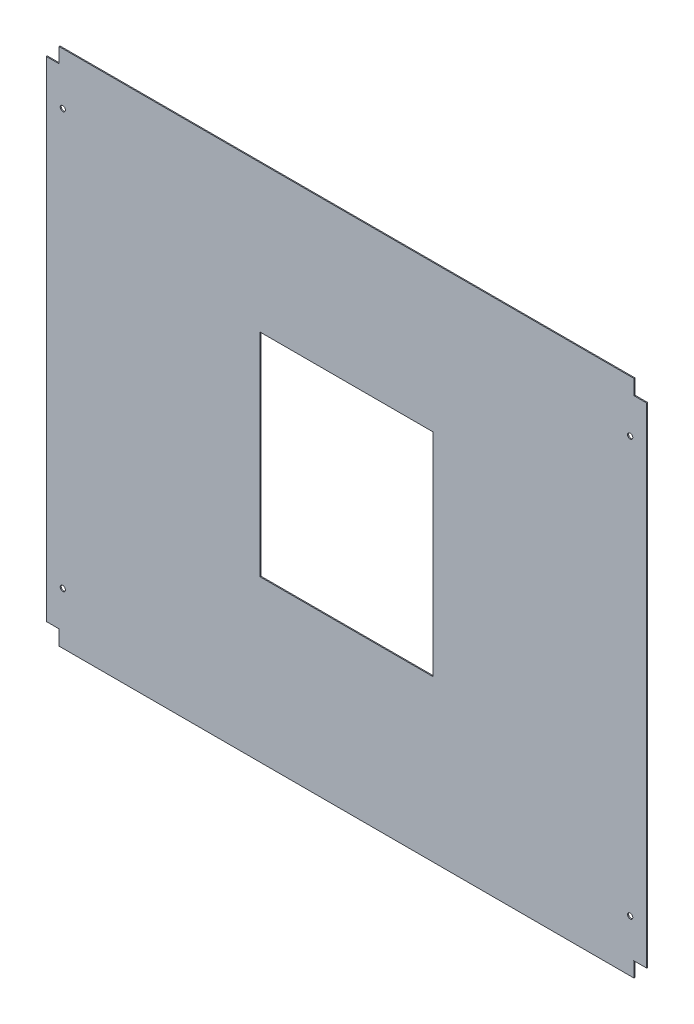
ISO-10303-21;
HEADER;
FILE_DESCRIPTION(('STEP AP214'),'2;1');
FILE_NAME('part.step','',(''),(''),'','','');
FILE_SCHEMA(('AUTOMOTIVE_DESIGN { 1 0 10303 214 1 1 1 1 }'));
ENDSEC;
DATA;
#1=APPLICATION_CONTEXT('core data for automotive mechanical design processes');
#2=APPLICATION_PROTOCOL_DEFINITION('international standard','automotive_design',2000,#1);
#3=PRODUCT_CONTEXT('',#1,'mechanical');
#4=PRODUCT('Part','Part','',(#3));
#5=PRODUCT_RELATED_PRODUCT_CATEGORY('part','',(#4));
#6=PRODUCT_DEFINITION_FORMATION('','',#4);
#7=PRODUCT_DEFINITION_CONTEXT('part definition',#1,'design');
#8=PRODUCT_DEFINITION('design','',#6,#7);
#9=PRODUCT_DEFINITION_SHAPE('','',#8);
#10=(LENGTH_UNIT() NAMED_UNIT(*) SI_UNIT(.MILLI.,.METRE.));
#11=(NAMED_UNIT(*) PLANE_ANGLE_UNIT() SI_UNIT($,.RADIAN.));
#12=(NAMED_UNIT(*) SI_UNIT($,.STERADIAN.) SOLID_ANGLE_UNIT());
#13=UNCERTAINTY_MEASURE_WITH_UNIT(LENGTH_MEASURE(1.E-05),#10,'distance_accuracy_value','');
#14=(GEOMETRIC_REPRESENTATION_CONTEXT(3) GLOBAL_UNCERTAINTY_ASSIGNED_CONTEXT((#13)) GLOBAL_UNIT_ASSIGNED_CONTEXT((#10,
#11,#12)) REPRESENTATION_CONTEXT('',''));
#15=CARTESIAN_POINT('',(0.,0.,0.));
#16=DIRECTION('',(0.,0.,1.));
#17=DIRECTION('',(1.,0.,0.));
#18=AXIS2_PLACEMENT_3D('',#15,#16,#17);
#19=CARTESIAN_POINT('',(-438.8866,374.0404,-1.52400000000006));
#20=DIRECTION('',(-1.,0.,0.));
#21=DIRECTION('',(0.,0.,1.));
#22=AXIS2_PLACEMENT_3D('',#19,#20,#21);
#23=PLANE('',#22);
#24=DIRECTION('',(0.,0.,1.));
#25=VECTOR('',#24,1.);
#26=CARTESIAN_POINT('',(-438.8866,373.888,-1.52400000000006));
#27=LINE('',#26,#25);
#28=CARTESIAN_POINT('',(-438.8866,373.888,-1.524));
#29=VERTEX_POINT('',#28);
#30=CARTESIAN_POINT('',(-438.8866,373.888,0.));
#31=VERTEX_POINT('',#30);
#32=EDGE_CURVE('E330',#29,#31,#27,.T.);
#33=ORIENTED_EDGE('',*,*,#32,.T.);
#34=DIRECTION('',(0.,1.,0.));
#35=VECTOR('',#34,1.);
#36=CARTESIAN_POINT('',(-438.8866,0.,0.));
#37=LINE('',#36,#35);
#38=CARTESIAN_POINT('',(-438.8866,374.0404,0.));
#39=VERTEX_POINT('',#38);
#40=EDGE_CURVE('E11',#31,#39,#37,.T.);
#41=ORIENTED_EDGE('',*,*,#40,.T.);
#42=DIRECTION('',(0.,0.,1.));
#43=VECTOR('',#42,1.);
#44=CARTESIAN_POINT('',(-438.8866,374.0404,-1.52400000000006));
#45=LINE('',#44,#43);
#46=CARTESIAN_POINT('',(-438.8866,374.0404,-1.524));
#47=VERTEX_POINT('',#46);
#48=EDGE_CURVE('E327',#47,#39,#45,.T.);
#49=ORIENTED_EDGE('',*,*,#48,.F.);
#50=DIRECTION('',(0.,-1.,0.));
#51=VECTOR('',#50,1.);
#52=CARTESIAN_POINT('',(-438.8866,374.0404,-1.52400000000006));
#53=LINE('',#52,#51);
#54=EDGE_CURVE('E61',#47,#29,#53,.T.);
#55=ORIENTED_EDGE('',*,*,#54,.T.);
#56=EDGE_LOOP('',(#33,#41,#49,#55));
#57=FACE_BOUND('',#56,.T.);
#58=ADVANCED_FACE('F45',(#57),#23,.T.);
#59=CARTESIAN_POINT('',(-438.8866,-373.888,-1.52400000000006));
#60=DIRECTION('',(-1.,0.,0.));
#61=DIRECTION('',(0.,0.,1.));
#62=AXIS2_PLACEMENT_3D('',#59,#60,#61);
#63=PLANE('',#62);
#64=DIRECTION('',(0.,0.,1.));
#65=VECTOR('',#64,1.);
#66=CARTESIAN_POINT('',(-438.8866,-374.0404,-1.52400000000006));
#67=LINE('',#66,#65);
#68=CARTESIAN_POINT('',(-438.8866,-374.0404,-1.524));
#69=VERTEX_POINT('',#68);
#70=CARTESIAN_POINT('',(-438.8866,-374.0404,0.));
#71=VERTEX_POINT('',#70);
#72=EDGE_CURVE('E320',#69,#71,#67,.T.);
#73=ORIENTED_EDGE('',*,*,#72,.T.);
#74=DIRECTION('',(0.,1.,0.));
#75=VECTOR('',#74,1.);
#76=CARTESIAN_POINT('',(-438.8866,0.,0.));
#77=LINE('',#76,#75);
#78=CARTESIAN_POINT('',(-438.8866,-373.888,0.));
#79=VERTEX_POINT('',#78);
#80=EDGE_CURVE('E54',#71,#79,#77,.T.);
#81=ORIENTED_EDGE('',*,*,#80,.T.);
#82=DIRECTION('',(0.,0.,1.));
#83=VECTOR('',#82,1.);
#84=CARTESIAN_POINT('',(-438.8866,-373.888,-1.52400000000006));
#85=LINE('',#84,#83);
#86=CARTESIAN_POINT('',(-438.8866,-373.888,-1.524));
#87=VERTEX_POINT('',#86);
#88=EDGE_CURVE('E339',#87,#79,#85,.T.);
#89=ORIENTED_EDGE('',*,*,#88,.F.);
#90=DIRECTION('',(0.,-1.,0.));
#91=VECTOR('',#90,1.);
#92=CARTESIAN_POINT('',(-438.8866,-373.888,-1.52400000000006));
#93=LINE('',#92,#91);
#94=EDGE_CURVE('E335',#87,#69,#93,.T.);
#95=ORIENTED_EDGE('',*,*,#94,.T.);
#96=EDGE_LOOP('',(#73,#81,#89,#95));
#97=FACE_BOUND('',#96,.T.);
#98=ADVANCED_FACE('F514',(#97),#63,.T.);
#99=CARTESIAN_POINT('',(-438.8866,-374.0404,-1.52400000000006));
#100=DIRECTION('',(0.,1.,0.));
#101=DIRECTION('',(0.,0.,1.));
#102=AXIS2_PLACEMENT_3D('',#99,#100,#101);
#103=PLANE('',#102);
#104=DIRECTION('',(0.,0.,1.));
#105=VECTOR('',#104,1.);
#106=CARTESIAN_POINT('',(-439.039,-374.0404,-1.524));
#107=LINE('',#106,#105);
#108=CARTESIAN_POINT('',(-439.039,-374.0404,-1.524));
#109=VERTEX_POINT('',#108);
#110=CARTESIAN_POINT('',(-439.039,-374.0404,0.));
#111=VERTEX_POINT('',#110);
#112=EDGE_CURVE('E506',#109,#111,#107,.T.);
#113=ORIENTED_EDGE('',*,*,#112,.T.);
#114=DIRECTION('',(1.,0.,0.));
#115=VECTOR('',#114,1.);
#116=CARTESIAN_POINT('',(0.,-374.0404,0.));
#117=LINE('',#116,#115);
#118=EDGE_CURVE('E366',#111,#71,#117,.T.);
#119=ORIENTED_EDGE('',*,*,#118,.T.);
#120=ORIENTED_EDGE('',*,*,#72,.F.);
#121=DIRECTION('',(-1.,0.,0.));
#122=VECTOR('',#121,1.);
#123=CARTESIAN_POINT('',(-438.8866,-374.0404,-1.52400000000006));
#124=LINE('',#123,#122);
#125=EDGE_CURVE('E340',#69,#109,#124,.T.);
#126=ORIENTED_EDGE('',*,*,#125,.T.);
#127=EDGE_LOOP('',(#113,#119,#120,#126));
#128=FACE_BOUND('',#127,.T.);
#129=ADVANCED_FACE('F522',(#128),#103,.T.);
#130=CARTESIAN_POINT('',(-442.087,374.0404,-1.52400000000006));
#131=DIRECTION('',(0.,-1.,0.));
#132=DIRECTION('',(0.,0.,-1.));
#133=AXIS2_PLACEMENT_3D('',#130,#131,#132);
#134=PLANE('',#133);
#135=ORIENTED_EDGE('',*,*,#48,.T.);
#136=DIRECTION('',(-1.,0.,0.));
#137=VECTOR('',#136,1.);
#138=CARTESIAN_POINT('',(0.,374.0404,0.));
#139=LINE('',#138,#137);
#140=CARTESIAN_POINT('',(-439.039,374.0404,0.));
#141=VERTEX_POINT('',#140);
#142=EDGE_CURVE('E362',#39,#141,#139,.T.);
#143=ORIENTED_EDGE('',*,*,#142,.T.);
#144=DIRECTION('',(0.,0.,-1.));
#145=VECTOR('',#144,1.);
#146=CARTESIAN_POINT('',(-439.039,374.0404,-1.524));
#147=LINE('',#146,#145);
#148=CARTESIAN_POINT('',(-439.039,374.0404,-1.52400000000006));
#149=VERTEX_POINT('',#148);
#150=EDGE_CURVE('E502',#141,#149,#147,.T.);
#151=ORIENTED_EDGE('',*,*,#150,.T.);
#152=DIRECTION('',(1.,0.,0.));
#153=VECTOR('',#152,1.);
#154=CARTESIAN_POINT('',(-442.087,374.0404,-1.52400000000006));
#155=LINE('',#154,#153);
#156=EDGE_CURVE('E321',#149,#47,#155,.T.);
#157=ORIENTED_EDGE('',*,*,#156,.T.);
#158=EDGE_LOOP('',(#135,#143,#151,#157));
#159=FACE_BOUND('',#158,.T.);
#160=ADVANCED_FACE('F575',(#159),#134,.T.);
#161=CARTESIAN_POINT('',(-438.8866,373.888,-1.52400000000006));
#162=DIRECTION('',(0.,1.,0.));
#163=DIRECTION('',(0.,0.,1.));
#164=AXIS2_PLACEMENT_3D('',#161,#162,#163);
#165=PLANE('',#164);
#166=DIRECTION('',(-1.,0.,0.));
#167=VECTOR('',#166,1.);
#168=CARTESIAN_POINT('',(-438.8866,373.888,-1.52400000000006));
#169=LINE('',#168,#167);
#170=CARTESIAN_POINT('',(-458.583962531012,373.888,-1.5239999999998));
#171=VERTEX_POINT('',#170);
#172=EDGE_CURVE('E66',#29,#171,#169,.T.);
#173=ORIENTED_EDGE('',*,*,#172,.T.);
#174=DIRECTION('',(0.,0.,-1.));
#175=VECTOR('',#174,1.);
#176=CARTESIAN_POINT('',(-458.583962531012,373.888,2.22044604925031E-13));
#177=LINE('',#176,#175);
#178=CARTESIAN_POINT('',(-458.583962531012,373.888,2.22044604925031E-13));
#179=VERTEX_POINT('',#178);
#180=EDGE_CURVE('E282',#179,#171,#177,.T.);
#181=ORIENTED_EDGE('',*,*,#180,.F.);
#182=DIRECTION('',(1.,0.,0.));
#183=VECTOR('',#182,1.);
#184=CARTESIAN_POINT('',(0.,373.888,0.));
#185=LINE('',#184,#183);
#186=EDGE_CURVE('E358',#179,#31,#185,.T.);
#187=ORIENTED_EDGE('',*,*,#186,.T.);
#188=ORIENTED_EDGE('',*,*,#32,.F.);
#189=EDGE_LOOP('',(#173,#181,#187,#188));
#190=FACE_BOUND('',#189,.T.);
#191=ADVANCED_FACE('F573',(#190),#165,.T.);
#192=CARTESIAN_POINT('',(-439.039,-373.888,-1.52400000000006));
#193=DIRECTION('',(0.,-1.,0.));
#194=DIRECTION('',(0.,0.,-1.));
#195=AXIS2_PLACEMENT_3D('',#192,#193,#194);
#196=PLANE('',#195);
#197=ORIENTED_EDGE('',*,*,#88,.T.);
#198=DIRECTION('',(-1.,0.,0.));
#199=VECTOR('',#198,1.);
#200=CARTESIAN_POINT('',(0.,-373.888,0.));
#201=LINE('',#200,#199);
#202=CARTESIAN_POINT('',(-458.583962531012,-373.888,1.11022302462516E-13));
#203=VERTEX_POINT('',#202);
#204=EDGE_CURVE('E324',#79,#203,#201,.T.);
#205=ORIENTED_EDGE('',*,*,#204,.T.);
#206=DIRECTION('',(0.,0.,-1.));
#207=VECTOR('',#206,1.);
#208=CARTESIAN_POINT('',(-458.583962531012,-373.888,1.11022302462516E-13));
#209=LINE('',#208,#207);
#210=CARTESIAN_POINT('',(-458.583962531012,-373.888,-1.52399999999991));
#211=VERTEX_POINT('',#210);
#212=EDGE_CURVE('E274',#203,#211,#209,.T.);
#213=ORIENTED_EDGE('',*,*,#212,.T.);
#214=DIRECTION('',(1.,0.,0.));
#215=VECTOR('',#214,1.);
#216=CARTESIAN_POINT('',(-439.039,-373.888,-1.52400000000006));
#217=LINE('',#216,#215);
#218=EDGE_CURVE('E331',#211,#87,#217,.T.);
#219=ORIENTED_EDGE('',*,*,#218,.T.);
#220=EDGE_LOOP('',(#197,#205,#213,#219));
#221=FACE_BOUND('',#220,.T.);
#222=ADVANCED_FACE('F517',(#221),#196,.T.);
#223=CARTESIAN_POINT('',(0.,0.,-1.524));
#224=DIRECTION('',(0.,0.,-1.));
#225=DIRECTION('',(-1.,0.,0.));
#226=AXIS2_PLACEMENT_3D('',#223,#224,#225);
#227=PLANE('',#226);
#228=CARTESIAN_POINT('',(-433.451,-317.5,-1.524));
#229=DIRECTION('',(0.,0.,-1.));
#230=DIRECTION('',(-1.,0.,0.));
#231=AXIS2_PLACEMENT_3D('',#228,#229,#230);
#232=CIRCLE('',#231,3.9624);
#233=CARTESIAN_POINT('',(-437.4134,-317.5,-1.524));
#234=VERTEX_POINT('',#233);
#235=EDGE_CURVE('E316',#234,#234,#232,.T.);
#236=ORIENTED_EDGE('',*,*,#235,.F.);
#237=EDGE_LOOP('',(#236));
#238=FACE_BOUND('',#237,.T.);
#239=CARTESIAN_POINT('',(433.451,317.5,-1.524));
#240=DIRECTION('',(0.,0.,-1.));
#241=DIRECTION('',(-1.,0.,0.));
#242=AXIS2_PLACEMENT_3D('',#239,#240,#241);
#243=CIRCLE('',#242,3.9624);
#244=CARTESIAN_POINT('',(429.4886,317.5,-1.524));
#245=VERTEX_POINT('',#244);
#246=EDGE_CURVE('E312',#245,#245,#243,.T.);
#247=ORIENTED_EDGE('',*,*,#246,.F.);
#248=EDGE_LOOP('',(#247));
#249=FACE_BOUND('',#248,.T.);
#250=CARTESIAN_POINT('',(433.451,-317.5,-1.524));
#251=DIRECTION('',(0.,0.,-1.));
#252=DIRECTION('',(-1.,0.,0.));
#253=AXIS2_PLACEMENT_3D('',#250,#251,#252);
#254=CIRCLE('',#253,3.9624);
#255=CARTESIAN_POINT('',(429.4886,-317.5,-1.524));
#256=VERTEX_POINT('',#255);
#257=EDGE_CURVE('E308',#256,#256,#254,.T.);
#258=ORIENTED_EDGE('',*,*,#257,.F.);
#259=EDGE_LOOP('',(#258));
#260=FACE_BOUND('',#259,.T.);
#261=CARTESIAN_POINT('',(-433.451,317.5,-1.524));
#262=DIRECTION('',(0.,0.,-1.));
#263=DIRECTION('',(-1.,0.,0.));
#264=AXIS2_PLACEMENT_3D('',#261,#262,#263);
#265=CIRCLE('',#264,3.9624);
#266=CARTESIAN_POINT('',(-437.4134,317.5,-1.524));
#267=VERTEX_POINT('',#266);
#268=EDGE_CURVE('E304',#267,#267,#265,.T.);
#269=ORIENTED_EDGE('',*,*,#268,.F.);
#270=EDGE_LOOP('',(#269));
#271=FACE_BOUND('',#270,.T.);
#272=DIRECTION('',(0.,-1.,0.));
#273=VECTOR('',#272,1.);
#274=CARTESIAN_POINT('',(-132.207,172.466,-1.524));
#275=LINE('',#274,#273);
#276=CARTESIAN_POINT('',(-132.207,172.466,-1.524));
#277=VERTEX_POINT('',#276);
#278=CARTESIAN_POINT('',(-132.207,-151.384,-1.524));
#279=VERTEX_POINT('',#278);
#280=EDGE_CURVE('E444',#277,#279,#275,.T.);
#281=ORIENTED_EDGE('',*,*,#280,.T.);
#282=DIRECTION('',(1.,0.,0.));
#283=VECTOR('',#282,1.);
#284=CARTESIAN_POINT('',(-132.207,-151.384,-1.524));
#285=LINE('',#284,#283);
#286=CARTESIAN_POINT('',(132.207,-151.384,-1.524));
#287=VERTEX_POINT('',#286);
#288=EDGE_CURVE('E448',#279,#287,#285,.T.);
#289=ORIENTED_EDGE('',*,*,#288,.T.);
#290=DIRECTION('',(0.,1.,0.));
#291=VECTOR('',#290,1.);
#292=CARTESIAN_POINT('',(132.207,172.466,-1.524));
#293=LINE('',#292,#291);
#294=CARTESIAN_POINT('',(132.207,172.466,-1.524));
#295=VERTEX_POINT('',#294);
#296=EDGE_CURVE('E453',#287,#295,#293,.T.);
#297=ORIENTED_EDGE('',*,*,#296,.T.);
#298=DIRECTION('',(-1.,0.,0.));
#299=VECTOR('',#298,1.);
#300=CARTESIAN_POINT('',(-132.207,172.466,-1.524));
#301=LINE('',#300,#299);
#302=EDGE_CURVE('E457',#295,#277,#301,.T.);
#303=ORIENTED_EDGE('',*,*,#302,.T.);
#304=EDGE_LOOP('',(#281,#289,#297,#303));
#305=FACE_BOUND('',#304,.T.);
#306=ORIENTED_EDGE('',*,*,#54,.F.);
#307=ORIENTED_EDGE('',*,*,#156,.F.);
#308=DIRECTION('',(0.,1.,0.));
#309=VECTOR('',#308,1.);
#310=CARTESIAN_POINT('',(-439.039,380.238,-1.524));
#311=LINE('',#310,#309);
#312=CARTESIAN_POINT('',(-439.039,396.734962531012,-1.52399999999991));
#313=VERTEX_POINT('',#312);
#314=EDGE_CURVE('E438',#149,#313,#311,.T.);
#315=ORIENTED_EDGE('',*,*,#314,.T.);
#316=DIRECTION('',(-1.,0.,0.));
#317=VECTOR('',#316,1.);
#318=CARTESIAN_POINT('',(0.,396.734962531012,-1.52399999999997));
#319=LINE('',#318,#317);
#320=CARTESIAN_POINT('',(439.039,396.734962531012,-1.52400000000003));
#321=VERTEX_POINT('',#320);
#322=EDGE_CURVE('E228',#313,#321,#319,.F.);
#323=ORIENTED_EDGE('',*,*,#322,.T.);
#324=DIRECTION('',(0.,-1.,0.));
#325=VECTOR('',#324,1.);
#326=CARTESIAN_POINT('',(439.039,380.238,-1.524));
#327=LINE('',#326,#325);
#328=CARTESIAN_POINT('',(439.039,374.0404,-1.524));
#329=VERTEX_POINT('',#328);
#330=EDGE_CURVE('E218',#321,#329,#327,.T.);
#331=ORIENTED_EDGE('',*,*,#330,.T.);
#332=DIRECTION('',(1.,0.,0.));
#333=VECTOR('',#332,1.);
#334=CARTESIAN_POINT('',(438.8866,374.0404,-1.52400000000003));
#335=LINE('',#334,#333);
#336=CARTESIAN_POINT('',(438.8866,374.0404,-1.524));
#337=VERTEX_POINT('',#336);
#338=EDGE_CURVE('E394',#337,#329,#335,.T.);
#339=ORIENTED_EDGE('',*,*,#338,.F.);
#340=DIRECTION('',(0.,1.,0.));
#341=VECTOR('',#340,1.);
#342=CARTESIAN_POINT('',(438.8866,373.888,-1.52400000000003));
#343=LINE('',#342,#341);
#344=CARTESIAN_POINT('',(438.8866,373.888,-1.524));
#345=VERTEX_POINT('',#344);
#346=EDGE_CURVE('E389',#345,#337,#343,.T.);
#347=ORIENTED_EDGE('',*,*,#346,.F.);
#348=DIRECTION('',(-1.,0.,0.));
#349=VECTOR('',#348,1.);
#350=CARTESIAN_POINT('',(439.039,373.888,-1.52400000000003));
#351=LINE('',#350,#349);
#352=CARTESIAN_POINT('',(458.583962531012,373.888,-1.52399999999991));
#353=VERTEX_POINT('',#352);
#354=EDGE_CURVE('E385',#353,#345,#351,.T.);
#355=ORIENTED_EDGE('',*,*,#354,.F.);
#356=DIRECTION('',(0.,-1.,0.));
#357=VECTOR('',#356,1.);
#358=CARTESIAN_POINT('',(458.583962531012,0.,-1.52399999999986));
#359=LINE('',#358,#357);
#360=CARTESIAN_POINT('',(458.583962531012,-373.888,-1.5239999999998));
#361=VERTEX_POINT('',#360);
#362=EDGE_CURVE('E246',#353,#361,#359,.T.);
#363=ORIENTED_EDGE('',*,*,#362,.T.);
#364=DIRECTION('',(1.,0.,0.));
#365=VECTOR('',#364,1.);
#366=CARTESIAN_POINT('',(438.8866,-373.888,-1.52400000000003));
#367=LINE('',#366,#365);
#368=CARTESIAN_POINT('',(438.8866,-373.888,-1.524));
#369=VERTEX_POINT('',#368);
#370=EDGE_CURVE('E381',#369,#361,#367,.T.);
#371=ORIENTED_EDGE('',*,*,#370,.F.);
#372=DIRECTION('',(0.,1.,0.));
#373=VECTOR('',#372,1.);
#374=CARTESIAN_POINT('',(438.8866,-374.0404,-1.52400000000003));
#375=LINE('',#374,#373);
#376=CARTESIAN_POINT('',(438.8866,-374.0404,-1.524));
#377=VERTEX_POINT('',#376);
#378=EDGE_CURVE('E376',#377,#369,#375,.T.);
#379=ORIENTED_EDGE('',*,*,#378,.F.);
#380=DIRECTION('',(-1.,0.,0.));
#381=VECTOR('',#380,1.);
#382=CARTESIAN_POINT('',(442.087,-374.0404,-1.52400000000003));
#383=LINE('',#382,#381);
#384=CARTESIAN_POINT('',(439.039,-374.0404,-1.52400000000003));
#385=VERTEX_POINT('',#384);
#386=EDGE_CURVE('E371',#385,#377,#383,.T.);
#387=ORIENTED_EDGE('',*,*,#386,.F.);
#388=DIRECTION('',(0.,-1.,0.));
#389=VECTOR('',#388,1.);
#390=CARTESIAN_POINT('',(439.039,-380.238,-1.524));
#391=LINE('',#390,#389);
#392=CARTESIAN_POINT('',(439.039,-396.734962531012,-1.52399999999991));
#393=VERTEX_POINT('',#392);
#394=EDGE_CURVE('E422',#385,#393,#391,.T.);
#395=ORIENTED_EDGE('',*,*,#394,.T.);
#396=DIRECTION('',(-1.,0.,0.));
#397=VECTOR('',#396,1.);
#398=CARTESIAN_POINT('',(0.,-396.734962531012,-1.52399999999991));
#399=LINE('',#398,#397);
#400=CARTESIAN_POINT('',(-439.039,-396.734962531012,-1.52399999999991));
#401=VERTEX_POINT('',#400);
#402=EDGE_CURVE('E263',#393,#401,#399,.T.);
#403=ORIENTED_EDGE('',*,*,#402,.T.);
#404=DIRECTION('',(0.,1.,0.));
#405=VECTOR('',#404,1.);
#406=CARTESIAN_POINT('',(-439.039,-380.238,-1.524));
#407=LINE('',#406,#405);
#408=EDGE_CURVE('E426',#401,#109,#407,.T.);
#409=ORIENTED_EDGE('',*,*,#408,.T.);
#410=ORIENTED_EDGE('',*,*,#125,.F.);
#411=ORIENTED_EDGE('',*,*,#94,.F.);
#412=ORIENTED_EDGE('',*,*,#218,.F.);
#413=DIRECTION('',(0.,1.,0.));
#414=VECTOR('',#413,1.);
#415=CARTESIAN_POINT('',(-458.583962531012,0.,-1.52399999999986));
#416=LINE('',#415,#414);
#417=EDGE_CURVE('E279',#211,#171,#416,.T.);
#418=ORIENTED_EDGE('',*,*,#417,.T.);
#419=ORIENTED_EDGE('',*,*,#172,.F.);
#420=EDGE_LOOP('',(#306,#307,#315,#323,#331,#339,#347,#355,#363,#371,#379,#387,#395,#403,#409,
#410,#411,#412,#418,#419));
#421=FACE_BOUND('',#420,.T.);
#422=ADVANCED_FACE('F520',(#238,#249,#260,#271,#305,#421),#227,.T.);
#423=CARTESIAN_POINT('',(0.,0.,0.));
#424=DIRECTION('',(0.,0.,-1.));
#425=DIRECTION('',(-1.,0.,0.));
#426=AXIS2_PLACEMENT_3D('',#423,#424,#425);
#427=PLANE('',#426);
#428=CARTESIAN_POINT('',(-433.451,-317.5,0.));
#429=DIRECTION('',(0.,0.,1.));
#430=DIRECTION('',(1.,0.,0.));
#431=AXIS2_PLACEMENT_3D('',#428,#429,#430);
#432=CIRCLE('',#431,3.9624);
#433=CARTESIAN_POINT('',(-429.4886,-317.5,0.));
#434=VERTEX_POINT('',#433);
#435=EDGE_CURVE('E293',#434,#434,#432,.T.);
#436=ORIENTED_EDGE('',*,*,#435,.F.);
#437=EDGE_LOOP('',(#436));
#438=FACE_BOUND('',#437,.T.);
#439=CARTESIAN_POINT('',(433.451,317.5,0.));
#440=DIRECTION('',(0.,0.,1.));
#441=DIRECTION('',(1.,0.,0.));
#442=AXIS2_PLACEMENT_3D('',#439,#440,#441);
#443=CIRCLE('',#442,3.9624);
#444=CARTESIAN_POINT('',(437.4134,317.5,0.));
#445=VERTEX_POINT('',#444);
#446=EDGE_CURVE('E292',#445,#445,#443,.T.);
#447=ORIENTED_EDGE('',*,*,#446,.F.);
#448=EDGE_LOOP('',(#447));
#449=FACE_BOUND('',#448,.T.);
#450=CARTESIAN_POINT('',(433.451,-317.5,0.));
#451=DIRECTION('',(0.,0.,1.));
#452=DIRECTION('',(1.,0.,0.));
#453=AXIS2_PLACEMENT_3D('',#450,#451,#452);
#454=CIRCLE('',#453,3.9624);
#455=CARTESIAN_POINT('',(437.4134,-317.5,0.));
#456=VERTEX_POINT('',#455);
#457=EDGE_CURVE('E278',#456,#456,#454,.T.);
#458=ORIENTED_EDGE('',*,*,#457,.F.);
#459=EDGE_LOOP('',(#458));
#460=FACE_BOUND('',#459,.T.);
#461=CARTESIAN_POINT('',(-433.451,317.5,0.));
#462=DIRECTION('',(0.,0.,1.));
#463=DIRECTION('',(1.,0.,0.));
#464=AXIS2_PLACEMENT_3D('',#461,#462,#463);
#465=CIRCLE('',#464,3.9624);
#466=CARTESIAN_POINT('',(-429.4886,317.5,0.));
#467=VERTEX_POINT('',#466);
#468=EDGE_CURVE('E297',#467,#467,#465,.T.);
#469=ORIENTED_EDGE('',*,*,#468,.F.);
#470=EDGE_LOOP('',(#469));
#471=FACE_BOUND('',#470,.T.);
#472=DIRECTION('',(1.,0.,0.));
#473=VECTOR('',#472,1.);
#474=CARTESIAN_POINT('',(-132.207,-151.384,0.));
#475=LINE('',#474,#473);
#476=CARTESIAN_POINT('',(-132.207,-151.384,0.));
#477=VERTEX_POINT('',#476);
#478=CARTESIAN_POINT('',(132.207,-151.384,0.));
#479=VERTEX_POINT('',#478);
#480=EDGE_CURVE('E464',#477,#479,#475,.T.);
#481=ORIENTED_EDGE('',*,*,#480,.F.);
#482=DIRECTION('',(0.,-1.,0.));
#483=VECTOR('',#482,1.);
#484=CARTESIAN_POINT('',(-132.207,172.466,0.));
#485=LINE('',#484,#483);
#486=CARTESIAN_POINT('',(-132.207,172.466,0.));
#487=VERTEX_POINT('',#486);
#488=EDGE_CURVE('E441',#487,#477,#485,.T.);
#489=ORIENTED_EDGE('',*,*,#488,.F.);
#490=DIRECTION('',(-1.,0.,0.));
#491=VECTOR('',#490,1.);
#492=CARTESIAN_POINT('',(-132.207,172.466,0.));
#493=LINE('',#492,#491);
#494=CARTESIAN_POINT('',(132.207,172.466,0.));
#495=VERTEX_POINT('',#494);
#496=EDGE_CURVE('E449',#495,#487,#493,.T.);
#497=ORIENTED_EDGE('',*,*,#496,.F.);
#498=DIRECTION('',(0.,1.,0.));
#499=VECTOR('',#498,1.);
#500=CARTESIAN_POINT('',(132.207,172.466,0.));
#501=LINE('',#500,#499);
#502=EDGE_CURVE('E468',#479,#495,#501,.T.);
#503=ORIENTED_EDGE('',*,*,#502,.F.);
#504=EDGE_LOOP('',(#481,#489,#497,#503));
#505=FACE_BOUND('',#504,.T.);
#506=ORIENTED_EDGE('',*,*,#142,.F.);
#507=ORIENTED_EDGE('',*,*,#40,.F.);
#508=ORIENTED_EDGE('',*,*,#186,.F.);
#509=DIRECTION('',(0.,-1.,0.));
#510=VECTOR('',#509,1.);
#511=CARTESIAN_POINT('',(-458.583962531012,-373.888,1.11022302462516E-13));
#512=LINE('',#511,#510);
#513=EDGE_CURVE('E262',#203,#179,#512,.F.);
#514=ORIENTED_EDGE('',*,*,#513,.F.);
#515=ORIENTED_EDGE('',*,*,#204,.F.);
#516=ORIENTED_EDGE('',*,*,#80,.F.);
#517=ORIENTED_EDGE('',*,*,#118,.F.);
#518=DIRECTION('',(0.,1.,0.));
#519=VECTOR('',#518,1.);
#520=CARTESIAN_POINT('',(-439.039,-380.238,0.));
#521=LINE('',#520,#519);
#522=CARTESIAN_POINT('',(-439.039,-396.734962531012,1.11022302462516E-13));
#523=VERTEX_POINT('',#522);
#524=EDGE_CURVE('E431',#523,#111,#521,.T.);
#525=ORIENTED_EDGE('',*,*,#524,.F.);
#526=DIRECTION('',(1.,0.,0.));
#527=VECTOR('',#526,1.);
#528=CARTESIAN_POINT('',(439.039,-396.734962531012,1.11022302462516E-13));
#529=LINE('',#528,#527);
#530=CARTESIAN_POINT('',(439.039,-396.734962531012,1.11022302462516E-13));
#531=VERTEX_POINT('',#530);
#532=EDGE_CURVE('E245',#531,#523,#529,.F.);
#533=ORIENTED_EDGE('',*,*,#532,.F.);
#534=DIRECTION('',(0.,-1.,0.));
#535=VECTOR('',#534,1.);
#536=CARTESIAN_POINT('',(439.039,-380.238,0.));
#537=LINE('',#536,#535);
#538=CARTESIAN_POINT('',(439.039,-374.0404,0.));
#539=VERTEX_POINT('',#538);
#540=EDGE_CURVE('E423',#539,#531,#537,.T.);
#541=ORIENTED_EDGE('',*,*,#540,.F.);
#542=DIRECTION('',(1.,0.,0.));
#543=VECTOR('',#542,1.);
#544=CARTESIAN_POINT('',(0.,-374.0404,0.));
#545=LINE('',#544,#543);
#546=CARTESIAN_POINT('',(438.8866,-374.0404,0.));
#547=VERTEX_POINT('',#546);
#548=EDGE_CURVE('E416',#547,#539,#545,.T.);
#549=ORIENTED_EDGE('',*,*,#548,.F.);
#550=DIRECTION('',(0.,-1.,0.));
#551=VECTOR('',#550,1.);
#552=CARTESIAN_POINT('',(438.8866,0.,0.));
#553=LINE('',#552,#551);
#554=CARTESIAN_POINT('',(438.8866,-373.888,0.));
#555=VERTEX_POINT('',#554);
#556=EDGE_CURVE('E498',#555,#547,#553,.T.);
#557=ORIENTED_EDGE('',*,*,#556,.F.);
#558=DIRECTION('',(-1.,0.,0.));
#559=VECTOR('',#558,1.);
#560=CARTESIAN_POINT('',(0.,-373.888,0.));
#561=LINE('',#560,#559);
#562=CARTESIAN_POINT('',(458.583962531012,-373.888,2.22044604925031E-13));
#563=VERTEX_POINT('',#562);
#564=EDGE_CURVE('E412',#563,#555,#561,.T.);
#565=ORIENTED_EDGE('',*,*,#564,.F.);
#566=DIRECTION('',(0.,1.,0.));
#567=VECTOR('',#566,1.);
#568=CARTESIAN_POINT('',(458.583962531012,373.888,1.11022302462516E-13));
#569=LINE('',#568,#567);
#570=CARTESIAN_POINT('',(458.583962531012,373.888,1.11022302462516E-13));
#571=VERTEX_POINT('',#570);
#572=EDGE_CURVE('E254',#571,#563,#569,.F.);
#573=ORIENTED_EDGE('',*,*,#572,.F.);
#574=DIRECTION('',(1.,0.,0.));
#575=VECTOR('',#574,1.);
#576=CARTESIAN_POINT('',(0.,373.888,0.));
#577=LINE('',#576,#575);
#578=CARTESIAN_POINT('',(438.8866,373.888,0.));
#579=VERTEX_POINT('',#578);
#580=EDGE_CURVE('E375',#579,#571,#577,.T.);
#581=ORIENTED_EDGE('',*,*,#580,.F.);
#582=DIRECTION('',(0.,-1.,0.));
#583=VECTOR('',#582,1.);
#584=CARTESIAN_POINT('',(438.8866,0.,0.));
#585=LINE('',#584,#583);
#586=CARTESIAN_POINT('',(438.8866,374.0404,0.));
#587=VERTEX_POINT('',#586);
#588=EDGE_CURVE('E494',#587,#579,#585,.T.);
#589=ORIENTED_EDGE('',*,*,#588,.F.);
#590=DIRECTION('',(-1.,0.,0.));
#591=VECTOR('',#590,1.);
#592=CARTESIAN_POINT('',(0.,374.0404,0.));
#593=LINE('',#592,#591);
#594=CARTESIAN_POINT('',(439.039,374.0404,0.));
#595=VERTEX_POINT('',#594);
#596=EDGE_CURVE('E213',#595,#587,#593,.T.);
#597=ORIENTED_EDGE('',*,*,#596,.F.);
#598=DIRECTION('',(0.,-1.,0.));
#599=VECTOR('',#598,1.);
#600=CARTESIAN_POINT('',(439.039,380.238,0.));
#601=LINE('',#600,#599);
#602=CARTESIAN_POINT('',(439.039,396.734962531012,0.));
#603=VERTEX_POINT('',#602);
#604=EDGE_CURVE('E207',#603,#595,#601,.T.);
#605=ORIENTED_EDGE('',*,*,#604,.F.);
#606=DIRECTION('',(1.,0.,0.));
#607=VECTOR('',#606,1.);
#608=CARTESIAN_POINT('',(439.039,396.734962531012,0.));
#609=LINE('',#608,#607);
#610=CARTESIAN_POINT('',(-439.039,396.734962531012,1.11022302462516E-13));
#611=VERTEX_POINT('',#610);
#612=EDGE_CURVE('E211',#611,#603,#609,.T.);
#613=ORIENTED_EDGE('',*,*,#612,.F.);
#614=DIRECTION('',(0.,1.,0.));
#615=VECTOR('',#614,1.);
#616=CARTESIAN_POINT('',(-439.039,380.238,0.));
#617=LINE('',#616,#615);
#618=EDGE_CURVE('E217',#141,#611,#617,.T.);
#619=ORIENTED_EDGE('',*,*,#618,.F.);
#620=EDGE_LOOP('',(#506,#507,#508,#514,#515,#516,#517,#525,#533,#541,#549,#557,#565,#573,#581,
#589,#597,#605,#613,#619));
#621=FACE_BOUND('',#620,.T.);
#622=ADVANCED_FACE('F47',(#438,#449,#460,#471,#505,#621),#427,.F.);
#623=CARTESIAN_POINT('',(-439.039,-380.238,-1.524));
#624=DIRECTION('',(1.,0.,0.));
#625=DIRECTION('',(0.,1.,0.));
#626=AXIS2_PLACEMENT_3D('',#623,#624,#625);
#627=PLANE('',#626);
#628=ORIENTED_EDGE('',*,*,#112,.F.);
#629=ORIENTED_EDGE('',*,*,#408,.F.);
#630=DIRECTION('',(0.,0.,-1.));
#631=VECTOR('',#630,1.);
#632=CARTESIAN_POINT('',(-439.039,-396.734962531012,1.11022302462516E-13));
#633=LINE('',#632,#631);
#634=EDGE_CURVE('E267',#523,#401,#633,.T.);
#635=ORIENTED_EDGE('',*,*,#634,.F.);
#636=ORIENTED_EDGE('',*,*,#524,.T.);
#637=EDGE_LOOP('',(#628,#629,#635,#636));
#638=FACE_BOUND('',#637,.T.);
#639=ADVANCED_FACE('F526',(#638),#627,.F.);
#640=CARTESIAN_POINT('',(-439.039,380.238,-1.524));
#641=DIRECTION('',(1.,0.,0.));
#642=DIRECTION('',(0.,0.,-1.));
#643=AXIS2_PLACEMENT_3D('',#640,#641,#642);
#644=PLANE('',#643);
#645=ORIENTED_EDGE('',*,*,#150,.F.);
#646=ORIENTED_EDGE('',*,*,#618,.T.);
#647=DIRECTION('',(0.,0.,-1.));
#648=VECTOR('',#647,1.);
#649=CARTESIAN_POINT('',(-439.039,396.734962531012,1.11022302462516E-13));
#650=LINE('',#649,#648);
#651=EDGE_CURVE('E233',#611,#313,#650,.T.);
#652=ORIENTED_EDGE('',*,*,#651,.T.);
#653=ORIENTED_EDGE('',*,*,#314,.F.);
#654=EDGE_LOOP('',(#645,#646,#652,#653));
#655=FACE_BOUND('',#654,.T.);
#656=ADVANCED_FACE('F642',(#655),#644,.F.);
#657=CARTESIAN_POINT('',(439.039,-380.238,-1.524));
#658=DIRECTION('',(-1.,0.,0.));
#659=DIRECTION('',(0.,0.,1.));
#660=AXIS2_PLACEMENT_3D('',#657,#658,#659);
#661=PLANE('',#660);
#662=ORIENTED_EDGE('',*,*,#540,.T.);
#663=DIRECTION('',(0.,0.,-1.));
#664=VECTOR('',#663,1.);
#665=CARTESIAN_POINT('',(439.039,-396.734962531012,1.11022302462516E-13));
#666=LINE('',#665,#664);
#667=EDGE_CURVE('E258',#531,#393,#666,.T.);
#668=ORIENTED_EDGE('',*,*,#667,.T.);
#669=ORIENTED_EDGE('',*,*,#394,.F.);
#670=DIRECTION('',(0.,0.,-1.));
#671=VECTOR('',#670,1.);
#672=CARTESIAN_POINT('',(439.039,-374.0404,-1.524));
#673=LINE('',#672,#671);
#674=EDGE_CURVE('E478',#539,#385,#673,.T.);
#675=ORIENTED_EDGE('',*,*,#674,.F.);
#676=EDGE_LOOP('',(#662,#668,#669,#675));
#677=FACE_BOUND('',#676,.T.);
#678=ADVANCED_FACE('F645',(#677),#661,.F.);
#679=CARTESIAN_POINT('',(438.8866,-374.0404,-1.52400000000003));
#680=DIRECTION('',(1.,0.,0.));
#681=DIRECTION('',(0.,0.,-1.));
#682=AXIS2_PLACEMENT_3D('',#679,#680,#681);
#683=PLANE('',#682);
#684=DIRECTION('',(0.,0.,1.));
#685=VECTOR('',#684,1.);
#686=CARTESIAN_POINT('',(438.8866,-373.888,-1.52400000000003));
#687=LINE('',#686,#685);
#688=EDGE_CURVE('E384',#369,#555,#687,.T.);
#689=ORIENTED_EDGE('',*,*,#688,.T.);
#690=ORIENTED_EDGE('',*,*,#556,.T.);
#691=DIRECTION('',(0.,0.,1.));
#692=VECTOR('',#691,1.);
#693=CARTESIAN_POINT('',(438.8866,-374.0404,-1.52400000000003));
#694=LINE('',#693,#692);
#695=EDGE_CURVE('E380',#377,#547,#694,.T.);
#696=ORIENTED_EDGE('',*,*,#695,.F.);
#697=ORIENTED_EDGE('',*,*,#378,.T.);
#698=EDGE_LOOP('',(#689,#690,#696,#697));
#699=FACE_BOUND('',#698,.T.);
#700=ADVANCED_FACE('F538',(#699),#683,.T.);
#701=CARTESIAN_POINT('',(438.8866,373.888,-1.52400000000003));
#702=DIRECTION('',(1.,0.,0.));
#703=DIRECTION('',(0.,0.,-1.));
#704=AXIS2_PLACEMENT_3D('',#701,#702,#703);
#705=PLANE('',#704);
#706=DIRECTION('',(0.,0.,1.));
#707=VECTOR('',#706,1.);
#708=CARTESIAN_POINT('',(438.8866,374.0404,-1.52400000000003));
#709=LINE('',#708,#707);
#710=EDGE_CURVE('E370',#337,#587,#709,.T.);
#711=ORIENTED_EDGE('',*,*,#710,.T.);
#712=ORIENTED_EDGE('',*,*,#588,.T.);
#713=DIRECTION('',(0.,0.,1.));
#714=VECTOR('',#713,1.);
#715=CARTESIAN_POINT('',(438.8866,373.888,-1.52400000000003));
#716=LINE('',#715,#714);
#717=EDGE_CURVE('E393',#345,#579,#716,.T.);
#718=ORIENTED_EDGE('',*,*,#717,.F.);
#719=ORIENTED_EDGE('',*,*,#346,.T.);
#720=EDGE_LOOP('',(#711,#712,#718,#719));
#721=FACE_BOUND('',#720,.T.);
#722=ADVANCED_FACE('F551',(#721),#705,.T.);
#723=CARTESIAN_POINT('',(438.8866,374.0404,-1.52400000000003));
#724=DIRECTION('',(0.,-1.,0.));
#725=DIRECTION('',(0.,0.,-1.));
#726=AXIS2_PLACEMENT_3D('',#723,#724,#725);
#727=PLANE('',#726);
#728=DIRECTION('',(0.,0.,1.));
#729=VECTOR('',#728,1.);
#730=CARTESIAN_POINT('',(439.039,374.0404,-1.524));
#731=LINE('',#730,#729);
#732=EDGE_CURVE('E491',#329,#595,#731,.T.);
#733=ORIENTED_EDGE('',*,*,#732,.T.);
#734=ORIENTED_EDGE('',*,*,#596,.T.);
#735=ORIENTED_EDGE('',*,*,#710,.F.);
#736=ORIENTED_EDGE('',*,*,#338,.T.);
#737=EDGE_LOOP('',(#733,#734,#735,#736));
#738=FACE_BOUND('',#737,.T.);
#739=ADVANCED_FACE('F555',(#738),#727,.T.);
#740=CARTESIAN_POINT('',(442.087,-374.0404,-1.52400000000003));
#741=DIRECTION('',(0.,1.,0.));
#742=DIRECTION('',(0.,0.,1.));
#743=AXIS2_PLACEMENT_3D('',#740,#741,#742);
#744=PLANE('',#743);
#745=ORIENTED_EDGE('',*,*,#695,.T.);
#746=ORIENTED_EDGE('',*,*,#548,.T.);
#747=ORIENTED_EDGE('',*,*,#674,.T.);
#748=ORIENTED_EDGE('',*,*,#386,.T.);
#749=EDGE_LOOP('',(#745,#746,#747,#748));
#750=FACE_BOUND('',#749,.T.);
#751=ADVANCED_FACE('F534',(#750),#744,.T.);
#752=CARTESIAN_POINT('',(438.8866,-373.888,-1.52400000000003));
#753=DIRECTION('',(0.,-1.,0.));
#754=DIRECTION('',(0.,0.,-1.));
#755=AXIS2_PLACEMENT_3D('',#752,#753,#754);
#756=PLANE('',#755);
#757=ORIENTED_EDGE('',*,*,#370,.T.);
#758=DIRECTION('',(0.,0.,-1.));
#759=VECTOR('',#758,1.);
#760=CARTESIAN_POINT('',(458.583962531012,-373.888,2.22044604925031E-13));
#761=LINE('',#760,#759);
#762=EDGE_CURVE('E250',#563,#361,#761,.T.);
#763=ORIENTED_EDGE('',*,*,#762,.F.);
#764=ORIENTED_EDGE('',*,*,#564,.T.);
#765=ORIENTED_EDGE('',*,*,#688,.F.);
#766=EDGE_LOOP('',(#757,#763,#764,#765));
#767=FACE_BOUND('',#766,.T.);
#768=ADVANCED_FACE('F543',(#767),#756,.T.);
#769=CARTESIAN_POINT('',(439.039,373.888,-1.52400000000003));
#770=DIRECTION('',(0.,1.,0.));
#771=DIRECTION('',(0.,0.,1.));
#772=AXIS2_PLACEMENT_3D('',#769,#770,#771);
#773=PLANE('',#772);
#774=ORIENTED_EDGE('',*,*,#717,.T.);
#775=ORIENTED_EDGE('',*,*,#580,.T.);
#776=DIRECTION('',(0.,0.,-1.));
#777=VECTOR('',#776,1.);
#778=CARTESIAN_POINT('',(458.583962531012,373.888,1.11022302462516E-13));
#779=LINE('',#778,#777);
#780=EDGE_CURVE('E241',#571,#353,#779,.T.);
#781=ORIENTED_EDGE('',*,*,#780,.T.);
#782=ORIENTED_EDGE('',*,*,#354,.T.);
#783=EDGE_LOOP('',(#774,#775,#781,#782));
#784=FACE_BOUND('',#783,.T.);
#785=ADVANCED_FACE('F553',(#784),#773,.T.);
#786=CARTESIAN_POINT('',(439.039,380.238,-1.524));
#787=DIRECTION('',(-1.,0.,0.));
#788=DIRECTION('',(0.,-1.,0.));
#789=AXIS2_PLACEMENT_3D('',#786,#787,#788);
#790=PLANE('',#789);
#791=ORIENTED_EDGE('',*,*,#732,.F.);
#792=ORIENTED_EDGE('',*,*,#330,.F.);
#793=DIRECTION('',(0.,0.,-1.));
#794=VECTOR('',#793,1.);
#795=CARTESIAN_POINT('',(439.039,396.734962531012,0.));
#796=LINE('',#795,#794);
#797=EDGE_CURVE('E221',#603,#321,#796,.T.);
#798=ORIENTED_EDGE('',*,*,#797,.F.);
#799=ORIENTED_EDGE('',*,*,#604,.T.);
#800=EDGE_LOOP('',(#791,#792,#798,#799));
#801=FACE_BOUND('',#800,.T.);
#802=ADVANCED_FACE('F222',(#801),#790,.F.);
#803=CARTESIAN_POINT('',(-132.207,172.466,-1.524));
#804=DIRECTION('',(-1.,0.,0.));
#805=DIRECTION('',(0.,-1.,0.));
#806=AXIS2_PLACEMENT_3D('',#803,#804,#805);
#807=PLANE('',#806);
#808=ORIENTED_EDGE('',*,*,#488,.T.);
#809=DIRECTION('',(0.,0.,1.));
#810=VECTOR('',#809,1.);
#811=CARTESIAN_POINT('',(-132.207,-151.384,-1.524));
#812=LINE('',#811,#810);
#813=EDGE_CURVE('E461',#279,#477,#812,.T.);
#814=ORIENTED_EDGE('',*,*,#813,.F.);
#815=ORIENTED_EDGE('',*,*,#280,.F.);
#816=DIRECTION('',(0.,0.,1.));
#817=VECTOR('',#816,1.);
#818=CARTESIAN_POINT('',(-132.207,172.466,-1.524));
#819=LINE('',#818,#817);
#820=EDGE_CURVE('E475',#277,#487,#819,.T.);
#821=ORIENTED_EDGE('',*,*,#820,.T.);
#822=EDGE_LOOP('',(#808,#814,#815,#821));
#823=FACE_BOUND('',#822,.T.);
#824=ADVANCED_FACE('F627',(#823),#807,.F.);
#825=CARTESIAN_POINT('',(-132.207,172.466,-1.524));
#826=DIRECTION('',(0.,1.,0.));
#827=DIRECTION('',(0.,0.,1.));
#828=AXIS2_PLACEMENT_3D('',#825,#826,#827);
#829=PLANE('',#828);
#830=ORIENTED_EDGE('',*,*,#496,.T.);
#831=ORIENTED_EDGE('',*,*,#820,.F.);
#832=ORIENTED_EDGE('',*,*,#302,.F.);
#833=DIRECTION('',(0.,0.,1.));
#834=VECTOR('',#833,1.);
#835=CARTESIAN_POINT('',(132.207,172.466,-1.524));
#836=LINE('',#835,#834);
#837=EDGE_CURVE('E479',#295,#495,#836,.T.);
#838=ORIENTED_EDGE('',*,*,#837,.T.);
#839=EDGE_LOOP('',(#830,#831,#832,#838));
#840=FACE_BOUND('',#839,.T.);
#841=ADVANCED_FACE('F630',(#840),#829,.F.);
#842=CARTESIAN_POINT('',(132.207,172.466,-1.524));
#843=DIRECTION('',(1.,0.,0.));
#844=DIRECTION('',(0.,1.,0.));
#845=AXIS2_PLACEMENT_3D('',#842,#843,#844);
#846=PLANE('',#845);
#847=ORIENTED_EDGE('',*,*,#502,.T.);
#848=ORIENTED_EDGE('',*,*,#837,.F.);
#849=ORIENTED_EDGE('',*,*,#296,.F.);
#850=DIRECTION('',(0.,0.,1.));
#851=VECTOR('',#850,1.);
#852=CARTESIAN_POINT('',(132.207,-151.384,-1.524));
#853=LINE('',#852,#851);
#854=EDGE_CURVE('E482',#287,#479,#853,.T.);
#855=ORIENTED_EDGE('',*,*,#854,.T.);
#856=EDGE_LOOP('',(#847,#848,#849,#855));
#857=FACE_BOUND('',#856,.T.);
#858=ADVANCED_FACE('F634',(#857),#846,.F.);
#859=CARTESIAN_POINT('',(-132.207,-151.384,-1.524));
#860=DIRECTION('',(0.,-1.,0.));
#861=DIRECTION('',(0.,0.,-1.));
#862=AXIS2_PLACEMENT_3D('',#859,#860,#861);
#863=PLANE('',#862);
#864=ORIENTED_EDGE('',*,*,#480,.T.);
#865=ORIENTED_EDGE('',*,*,#854,.F.);
#866=ORIENTED_EDGE('',*,*,#288,.F.);
#867=ORIENTED_EDGE('',*,*,#813,.T.);
#868=EDGE_LOOP('',(#864,#865,#866,#867));
#869=FACE_BOUND('',#868,.T.);
#870=ADVANCED_FACE('F612',(#869),#863,.F.);
#871=CARTESIAN_POINT('',(-433.451,317.5,-19.05));
#872=DIRECTION('',(0.,0.,1.));
#873=DIRECTION('',(1.,0.,0.));
#874=AXIS2_PLACEMENT_3D('',#871,#872,#873);
#875=CYLINDRICAL_SURFACE('',#874,3.9624);
#876=ORIENTED_EDGE('',*,*,#268,.T.);
#877=EDGE_LOOP('',(#876));
#878=FACE_BOUND('',#877,.T.);
#879=ORIENTED_EDGE('',*,*,#468,.T.);
#880=EDGE_LOOP('',(#879));
#881=FACE_BOUND('',#880,.T.);
#882=ADVANCED_FACE('F605',(#878,#881),#875,.F.);
#883=CARTESIAN_POINT('',(433.451,-317.5,-19.05));
#884=DIRECTION('',(0.,0.,1.));
#885=DIRECTION('',(1.,0.,0.));
#886=AXIS2_PLACEMENT_3D('',#883,#884,#885);
#887=CYLINDRICAL_SURFACE('',#886,3.9624);
#888=ORIENTED_EDGE('',*,*,#257,.T.);
#889=EDGE_LOOP('',(#888));
#890=FACE_BOUND('',#889,.T.);
#891=ORIENTED_EDGE('',*,*,#457,.T.);
#892=EDGE_LOOP('',(#891));
#893=FACE_BOUND('',#892,.T.);
#894=ADVANCED_FACE('F603',(#890,#893),#887,.F.);
#895=CARTESIAN_POINT('',(433.451,317.5,-19.05));
#896=DIRECTION('',(0.,0.,1.));
#897=DIRECTION('',(1.,0.,0.));
#898=AXIS2_PLACEMENT_3D('',#895,#896,#897);
#899=CYLINDRICAL_SURFACE('',#898,3.9624);
#900=ORIENTED_EDGE('',*,*,#246,.T.);
#901=EDGE_LOOP('',(#900));
#902=FACE_BOUND('',#901,.T.);
#903=ORIENTED_EDGE('',*,*,#446,.T.);
#904=EDGE_LOOP('',(#903));
#905=FACE_BOUND('',#904,.T.);
#906=ADVANCED_FACE('F598',(#902,#905),#899,.F.);
#907=CARTESIAN_POINT('',(-433.451,-317.5,-19.05));
#908=DIRECTION('',(0.,0.,1.));
#909=DIRECTION('',(1.,0.,0.));
#910=AXIS2_PLACEMENT_3D('',#907,#908,#909);
#911=CYLINDRICAL_SURFACE('',#910,3.9624);
#912=ORIENTED_EDGE('',*,*,#235,.T.);
#913=EDGE_LOOP('',(#912));
#914=FACE_BOUND('',#913,.T.);
#915=ORIENTED_EDGE('',*,*,#435,.T.);
#916=EDGE_LOOP('',(#915));
#917=FACE_BOUND('',#916,.T.);
#918=ADVANCED_FACE('F591',(#914,#917),#911,.F.);
#919=CARTESIAN_POINT('',(-458.583962531012,-373.888,1.11022302462516E-13));
#920=DIRECTION('',(-1.,0.,0.));
#921=DIRECTION('',(0.,0.,1.));
#922=AXIS2_PLACEMENT_3D('',#919,#920,#921);
#923=PLANE('',#922);
#924=ORIENTED_EDGE('',*,*,#417,.F.);
#925=ORIENTED_EDGE('',*,*,#212,.F.);
#926=ORIENTED_EDGE('',*,*,#513,.T.);
#927=ORIENTED_EDGE('',*,*,#180,.T.);
#928=EDGE_LOOP('',(#924,#925,#926,#927));
#929=FACE_BOUND('',#928,.T.);
#930=ADVANCED_FACE('F589',(#929),#923,.T.);
#931=CARTESIAN_POINT('',(439.039,-396.734962531012,1.11022302462516E-13));
#932=DIRECTION('',(0.,-1.,0.));
#933=DIRECTION('',(0.,0.,-1.));
#934=AXIS2_PLACEMENT_3D('',#931,#932,#933);
#935=PLANE('',#934);
#936=ORIENTED_EDGE('',*,*,#402,.F.);
#937=ORIENTED_EDGE('',*,*,#667,.F.);
#938=ORIENTED_EDGE('',*,*,#532,.T.);
#939=ORIENTED_EDGE('',*,*,#634,.T.);
#940=EDGE_LOOP('',(#936,#937,#938,#939));
#941=FACE_BOUND('',#940,.T.);
#942=ADVANCED_FACE('F530',(#941),#935,.T.);
#943=CARTESIAN_POINT('',(458.583962531012,373.888,1.11022302462516E-13));
#944=DIRECTION('',(1.,0.,0.));
#945=DIRECTION('',(0.,0.,-1.));
#946=AXIS2_PLACEMENT_3D('',#943,#944,#945);
#947=PLANE('',#946);
#948=ORIENTED_EDGE('',*,*,#362,.F.);
#949=ORIENTED_EDGE('',*,*,#780,.F.);
#950=ORIENTED_EDGE('',*,*,#572,.T.);
#951=ORIENTED_EDGE('',*,*,#762,.T.);
#952=EDGE_LOOP('',(#948,#949,#950,#951));
#953=FACE_BOUND('',#952,.T.);
#954=ADVANCED_FACE('F547',(#953),#947,.T.);
#955=CARTESIAN_POINT('',(439.039,396.734962531012,0.));
#956=DIRECTION('',(0.,1.,0.));
#957=DIRECTION('',(0.,0.,1.));
#958=AXIS2_PLACEMENT_3D('',#955,#956,#957);
#959=PLANE('',#958);
#960=ORIENTED_EDGE('',*,*,#322,.F.);
#961=ORIENTED_EDGE('',*,*,#651,.F.);
#962=ORIENTED_EDGE('',*,*,#612,.T.);
#963=ORIENTED_EDGE('',*,*,#797,.T.);
#964=EDGE_LOOP('',(#960,#961,#962,#963));
#965=FACE_BOUND('',#964,.T.);
#966=ADVANCED_FACE('F231',(#965),#959,.T.);
#967=CLOSED_SHELL('',(#58,#98,#129,#160,#191,#222,#422,#622,#639,#656,#678,#700,#722,#739,#751,
#768,#785,#802,#824,#841,#858,#870,#882,#894,#906,#918,#930,#942,#954,#966));
#968=MANIFOLD_SOLID_BREP('B2',#967);
#969=ADVANCED_BREP_SHAPE_REPRESENTATION('',(#18,#968),#14);
#970=SHAPE_DEFINITION_REPRESENTATION(#9,#969);
ENDSEC;
END-ISO-10303-21;
